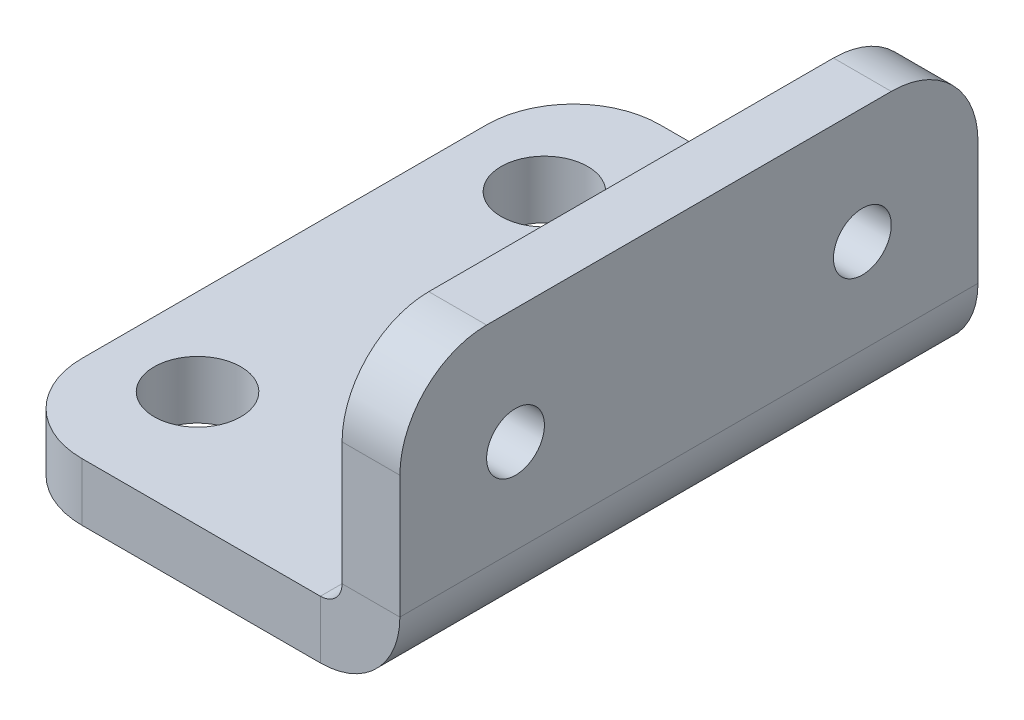
ISO-10303-21;
HEADER;
FILE_DESCRIPTION(('STEP AP214'),'2;1');
FILE_NAME('part.step','',(''),(''),'','','');
FILE_SCHEMA(('AUTOMOTIVE_DESIGN { 1 0 10303 214 1 1 1 1 }'));
ENDSEC;
DATA;
#1=APPLICATION_CONTEXT('core data for automotive mechanical design processes');
#2=APPLICATION_PROTOCOL_DEFINITION('international standard','automotive_design',2000,#1);
#3=PRODUCT_CONTEXT('',#1,'mechanical');
#4=PRODUCT('Part','Part','',(#3));
#5=PRODUCT_RELATED_PRODUCT_CATEGORY('part','',(#4));
#6=PRODUCT_DEFINITION_FORMATION('','',#4);
#7=PRODUCT_DEFINITION_CONTEXT('part definition',#1,'design');
#8=PRODUCT_DEFINITION('design','',#6,#7);
#9=PRODUCT_DEFINITION_SHAPE('','',#8);
#10=(LENGTH_UNIT() NAMED_UNIT(*) SI_UNIT(.MILLI.,.METRE.));
#11=(NAMED_UNIT(*) PLANE_ANGLE_UNIT() SI_UNIT($,.RADIAN.));
#12=(NAMED_UNIT(*) SI_UNIT($,.STERADIAN.) SOLID_ANGLE_UNIT());
#13=UNCERTAINTY_MEASURE_WITH_UNIT(LENGTH_MEASURE(1.E-05),#10,'distance_accuracy_value','');
#14=(GEOMETRIC_REPRESENTATION_CONTEXT(3) GLOBAL_UNCERTAINTY_ASSIGNED_CONTEXT((#13)) GLOBAL_UNIT_ASSIGNED_CONTEXT((#10,
#11,#12)) REPRESENTATION_CONTEXT('',''));
#15=CARTESIAN_POINT('',(0.,0.,0.));
#16=DIRECTION('',(0.,0.,1.));
#17=DIRECTION('',(1.,0.,0.));
#18=AXIS2_PLACEMENT_3D('',#15,#16,#17);
#19=CARTESIAN_POINT('',(0.,0.75,10.));
#20=DIRECTION('',(0.,0.,1.));
#21=DIRECTION('',(1.,0.,0.));
#22=AXIS2_PLACEMENT_3D('',#19,#20,#21);
#23=PLANE('',#22);
#24=DIRECTION('',(1.,0.,0.));
#25=VECTOR('',#24,1.);
#26=CARTESIAN_POINT('',(0.,0.75,10.));
#27=LINE('',#26,#25);
#28=CARTESIAN_POINT('',(0.,0.75,10.));
#29=VERTEX_POINT('',#28);
#30=CARTESIAN_POINT('',(2.,0.75,10.));
#31=VERTEX_POINT('',#30);
#32=EDGE_CURVE('E130',#29,#31,#27,.T.);
#33=ORIENTED_EDGE('',*,*,#32,.F.);
#34=CARTESIAN_POINT('',(-0.75,0.75,10.));
#35=DIRECTION('',(0.,0.,-1.));
#36=DIRECTION('',(-1.,0.,0.));
#37=AXIS2_PLACEMENT_3D('',#34,#35,#36);
#38=CIRCLE('',#37,0.75);
#39=CARTESIAN_POINT('',(-0.750000000000001,0.,10.));
#40=VERTEX_POINT('',#39);
#41=EDGE_CURVE('E134',#40,#29,#38,.F.);
#42=ORIENTED_EDGE('',*,*,#41,.F.);
#43=DIRECTION('',(0.,1.,0.));
#44=VECTOR('',#43,1.);
#45=CARTESIAN_POINT('',(-0.750000000000001,-2.,10.));
#46=LINE('',#45,#44);
#47=CARTESIAN_POINT('',(-0.750000000000001,-2.,10.));
#48=VERTEX_POINT('',#47);
#49=EDGE_CURVE('E139',#48,#40,#46,.T.);
#50=ORIENTED_EDGE('',*,*,#49,.F.);
#51=CARTESIAN_POINT('',(-0.75,0.75,10.));
#52=DIRECTION('',(0.,0.,1.));
#53=DIRECTION('',(1.,0.,0.));
#54=AXIS2_PLACEMENT_3D('',#51,#52,#53);
#55=CIRCLE('',#54,2.75);
#56=EDGE_CURVE('E136',#48,#31,#55,.T.);
#57=ORIENTED_EDGE('',*,*,#56,.T.);
#58=EDGE_LOOP('',(#33,#42,#50,#57));
#59=FACE_BOUND('',#58,.T.);
#60=ADVANCED_FACE('F39',(#59),#23,.T.);
#61=CARTESIAN_POINT('',(-0.750000000000001,-2.,10.));
#62=DIRECTION('',(0.,0.,1.));
#63=DIRECTION('',(1.,0.,0.));
#64=AXIS2_PLACEMENT_3D('',#61,#62,#63);
#65=PLANE('',#64);
#66=DIRECTION('',(0.,1.,0.));
#67=VECTOR('',#66,1.);
#68=CARTESIAN_POINT('',(2.,0.,10.));
#69=LINE('',#68,#67);
#70=CARTESIAN_POINT('',(2.,5.,10.));
#71=VERTEX_POINT('',#70);
#72=EDGE_CURVE('E157',#31,#71,#69,.T.);
#73=ORIENTED_EDGE('',*,*,#72,.T.);
#74=DIRECTION('',(1.,0.,0.));
#75=VECTOR('',#74,1.);
#76=CARTESIAN_POINT('',(-0.750000000000001,5.,10.));
#77=LINE('',#76,#75);
#78=CARTESIAN_POINT('',(0.,5.,10.));
#79=VERTEX_POINT('',#78);
#80=EDGE_CURVE('E11',#71,#79,#77,.F.);
#81=ORIENTED_EDGE('',*,*,#80,.T.);
#82=DIRECTION('',(0.,1.,0.));
#83=VECTOR('',#82,1.);
#84=CARTESIAN_POINT('',(0.,0.,10.));
#85=LINE('',#84,#83);
#86=EDGE_CURVE('E146',#29,#79,#85,.T.);
#87=ORIENTED_EDGE('',*,*,#86,.F.);
#88=ORIENTED_EDGE('',*,*,#32,.T.);
#89=EDGE_LOOP('',(#73,#81,#87,#88));
#90=FACE_BOUND('',#89,.T.);
#91=ADVANCED_FACE('F156',(#90),#65,.T.);
#92=CARTESIAN_POINT('',(-0.750000000000001,0.,-10.));
#93=DIRECTION('',(0.,0.,-1.));
#94=DIRECTION('',(-1.,0.,0.));
#95=AXIS2_PLACEMENT_3D('',#92,#93,#94);
#96=PLANE('',#95);
#97=DIRECTION('',(0.,-1.,0.));
#98=VECTOR('',#97,1.);
#99=CARTESIAN_POINT('',(-0.750000000000001,0.,-10.));
#100=LINE('',#99,#98);
#101=CARTESIAN_POINT('',(-0.750000000000001,0.,-10.));
#102=VERTEX_POINT('',#101);
#103=CARTESIAN_POINT('',(-0.750000000000001,-2.,-10.));
#104=VERTEX_POINT('',#103);
#105=EDGE_CURVE('E202',#102,#104,#100,.T.);
#106=ORIENTED_EDGE('',*,*,#105,.F.);
#107=CARTESIAN_POINT('',(-0.75,0.75,-10.));
#108=DIRECTION('',(0.,0.,-1.));
#109=DIRECTION('',(-1.,0.,0.));
#110=AXIS2_PLACEMENT_3D('',#107,#108,#109);
#111=CIRCLE('',#110,0.75);
#112=CARTESIAN_POINT('',(0.,0.75,-10.));
#113=VERTEX_POINT('',#112);
#114=EDGE_CURVE('E176',#102,#113,#111,.F.);
#115=ORIENTED_EDGE('',*,*,#114,.T.);
#116=DIRECTION('',(-1.,0.,0.));
#117=VECTOR('',#116,1.);
#118=CARTESIAN_POINT('',(2.,0.75,-10.));
#119=LINE('',#118,#117);
#120=CARTESIAN_POINT('',(2.,0.75,-10.));
#121=VERTEX_POINT('',#120);
#122=EDGE_CURVE('E200',#121,#113,#119,.T.);
#123=ORIENTED_EDGE('',*,*,#122,.F.);
#124=CARTESIAN_POINT('',(-0.75,0.75,-10.));
#125=DIRECTION('',(0.,0.,1.));
#126=DIRECTION('',(1.,0.,0.));
#127=AXIS2_PLACEMENT_3D('',#124,#125,#126);
#128=CIRCLE('',#127,2.75);
#129=EDGE_CURVE('E182',#104,#121,#128,.T.);
#130=ORIENTED_EDGE('',*,*,#129,.F.);
#131=EDGE_LOOP('',(#106,#115,#123,#130));
#132=FACE_BOUND('',#131,.T.);
#133=ADVANCED_FACE('F305',(#132),#96,.T.);
#134=CARTESIAN_POINT('',(2.,0.75,-10.));
#135=DIRECTION('',(0.,0.,-1.));
#136=DIRECTION('',(-1.,0.,0.));
#137=AXIS2_PLACEMENT_3D('',#134,#135,#136);
#138=PLANE('',#137);
#139=DIRECTION('',(1.,0.,0.));
#140=VECTOR('',#139,1.);
#141=CARTESIAN_POINT('',(-12.,-2.,-10.));
#142=LINE('',#141,#140);
#143=CARTESIAN_POINT('',(-9.,-2.,-10.));
#144=VERTEX_POINT('',#143);
#145=EDGE_CURVE('E180',#144,#104,#142,.T.);
#146=ORIENTED_EDGE('',*,*,#145,.F.);
#147=DIRECTION('',(0.,1.,0.));
#148=VECTOR('',#147,1.);
#149=CARTESIAN_POINT('',(-9.,0.75,-10.));
#150=LINE('',#149,#148);
#151=CARTESIAN_POINT('',(-9.,0.,-10.));
#152=VERTEX_POINT('',#151);
#153=EDGE_CURVE('E221',#144,#152,#150,.T.);
#154=ORIENTED_EDGE('',*,*,#153,.T.);
#155=DIRECTION('',(1.,0.,0.));
#156=VECTOR('',#155,1.);
#157=CARTESIAN_POINT('',(-12.,0.,-10.));
#158=LINE('',#157,#156);
#159=EDGE_CURVE('E178',#152,#102,#158,.T.);
#160=ORIENTED_EDGE('',*,*,#159,.T.);
#161=ORIENTED_EDGE('',*,*,#105,.T.);
#162=EDGE_LOOP('',(#146,#154,#160,#161));
#163=FACE_BOUND('',#162,.T.);
#164=ADVANCED_FACE('F358',(#163),#138,.T.);
#165=CARTESIAN_POINT('',(2.,0.,10.));
#166=DIRECTION('',(-1.,0.,0.));
#167=DIRECTION('',(0.,0.,1.));
#168=AXIS2_PLACEMENT_3D('',#165,#166,#167);
#169=PLANE('',#168);
#170=CARTESIAN_POINT('',(2.,4.,6.));
#171=DIRECTION('',(-1.,0.,0.));
#172=DIRECTION('',(0.,0.,1.));
#173=AXIS2_PLACEMENT_3D('',#170,#171,#172);
#174=CIRCLE('',#173,1.);
#175=CARTESIAN_POINT('',(2.,4.,7.));
#176=VERTEX_POINT('',#175);
#177=EDGE_CURVE('E255',#176,#176,#174,.T.);
#178=ORIENTED_EDGE('',*,*,#177,.T.);
#179=EDGE_LOOP('',(#178));
#180=FACE_BOUND('',#179,.T.);
#181=CARTESIAN_POINT('',(2.,3.99999999999992,-6.));
#182=DIRECTION('',(-1.,0.,0.));
#183=DIRECTION('',(0.,0.,1.));
#184=AXIS2_PLACEMENT_3D('',#181,#182,#183);
#185=CIRCLE('',#184,1.);
#186=CARTESIAN_POINT('',(2.,3.99999999999992,-5.));
#187=VERTEX_POINT('',#186);
#188=EDGE_CURVE('E266',#187,#187,#185,.T.);
#189=ORIENTED_EDGE('',*,*,#188,.T.);
#190=EDGE_LOOP('',(#189));
#191=FACE_BOUND('',#190,.T.);
#192=DIRECTION('',(0.,1.,0.));
#193=VECTOR('',#192,1.);
#194=CARTESIAN_POINT('',(2.,0.,-10.));
#195=LINE('',#194,#193);
#196=CARTESIAN_POINT('',(2.,5.,-10.));
#197=VERTEX_POINT('',#196);
#198=EDGE_CURVE('E171',#121,#197,#195,.T.);
#199=ORIENTED_EDGE('',*,*,#198,.T.);
#200=CARTESIAN_POINT('',(2.,5.,-7.));
#201=DIRECTION('',(-1.,0.,0.));
#202=DIRECTION('',(0.,0.,1.));
#203=AXIS2_PLACEMENT_3D('',#200,#201,#202);
#204=CIRCLE('',#203,3.);
#205=CARTESIAN_POINT('',(2.,8.,-7.));
#206=VERTEX_POINT('',#205);
#207=EDGE_CURVE('E229',#197,#206,#204,.F.);
#208=ORIENTED_EDGE('',*,*,#207,.T.);
#209=DIRECTION('',(0.,0.,-1.));
#210=VECTOR('',#209,1.);
#211=CARTESIAN_POINT('',(2.,8.,10.));
#212=LINE('',#211,#210);
#213=CARTESIAN_POINT('',(2.,8.,7.));
#214=VERTEX_POINT('',#213);
#215=EDGE_CURVE('E198',#214,#206,#212,.T.);
#216=ORIENTED_EDGE('',*,*,#215,.F.);
#217=CARTESIAN_POINT('',(2.,5.,7.));
#218=DIRECTION('',(-1.,0.,0.));
#219=DIRECTION('',(0.,0.,1.));
#220=AXIS2_PLACEMENT_3D('',#217,#218,#219);
#221=CIRCLE('',#220,3.);
#222=EDGE_CURVE('E227',#214,#71,#221,.F.);
#223=ORIENTED_EDGE('',*,*,#222,.T.);
#224=ORIENTED_EDGE('',*,*,#72,.F.);
#225=DIRECTION('',(0.,0.,-1.));
#226=VECTOR('',#225,1.);
#227=CARTESIAN_POINT('',(2.,0.75,10.));
#228=LINE('',#227,#226);
#229=EDGE_CURVE('E170',#31,#121,#228,.T.);
#230=ORIENTED_EDGE('',*,*,#229,.T.);
#231=EDGE_LOOP('',(#199,#208,#216,#223,#224,#230));
#232=FACE_BOUND('',#231,.T.);
#233=ADVANCED_FACE('F245',(#180,#191,#232),#169,.F.);
#234=CARTESIAN_POINT('',(0.,8.,10.));
#235=DIRECTION('',(0.,1.,0.));
#236=DIRECTION('',(0.,0.,1.));
#237=AXIS2_PLACEMENT_3D('',#234,#235,#236);
#238=PLANE('',#237);
#239=ORIENTED_EDGE('',*,*,#215,.T.);
#240=DIRECTION('',(1.,0.,0.));
#241=VECTOR('',#240,1.);
#242=CARTESIAN_POINT('',(0.,8.,-7.));
#243=LINE('',#242,#241);
#244=CARTESIAN_POINT('',(0.,8.,-7.));
#245=VERTEX_POINT('',#244);
#246=EDGE_CURVE('E60',#206,#245,#243,.F.);
#247=ORIENTED_EDGE('',*,*,#246,.T.);
#248=DIRECTION('',(0.,0.,-1.));
#249=VECTOR('',#248,1.);
#250=CARTESIAN_POINT('',(0.,8.,10.));
#251=LINE('',#250,#249);
#252=CARTESIAN_POINT('',(0.,8.,7.));
#253=VERTEX_POINT('',#252);
#254=EDGE_CURVE('E153',#253,#245,#251,.T.);
#255=ORIENTED_EDGE('',*,*,#254,.F.);
#256=DIRECTION('',(1.,0.,0.));
#257=VECTOR('',#256,1.);
#258=CARTESIAN_POINT('',(0.,8.,7.));
#259=LINE('',#258,#257);
#260=EDGE_CURVE('E231',#253,#214,#259,.T.);
#261=ORIENTED_EDGE('',*,*,#260,.T.);
#262=EDGE_LOOP('',(#239,#247,#255,#261));
#263=FACE_BOUND('',#262,.T.);
#264=ADVANCED_FACE('F246',(#263),#238,.T.);
#265=CARTESIAN_POINT('',(0.,0.,10.));
#266=DIRECTION('',(-1.,0.,0.));
#267=DIRECTION('',(0.,0.,1.));
#268=AXIS2_PLACEMENT_3D('',#265,#266,#267);
#269=PLANE('',#268);
#270=CARTESIAN_POINT('',(0.,4.,6.));
#271=DIRECTION('',(-1.,0.,0.));
#272=DIRECTION('',(0.,0.,1.));
#273=AXIS2_PLACEMENT_3D('',#270,#271,#272);
#274=CIRCLE('',#273,1.);
#275=CARTESIAN_POINT('',(0.,4.,7.));
#276=VERTEX_POINT('',#275);
#277=EDGE_CURVE('E269',#276,#276,#274,.T.);
#278=ORIENTED_EDGE('',*,*,#277,.F.);
#279=EDGE_LOOP('',(#278));
#280=FACE_BOUND('',#279,.T.);
#281=CARTESIAN_POINT('',(0.,3.99999999999992,-6.));
#282=DIRECTION('',(-1.,0.,0.));
#283=DIRECTION('',(0.,0.,1.));
#284=AXIS2_PLACEMENT_3D('',#281,#282,#283);
#285=CIRCLE('',#284,1.);
#286=CARTESIAN_POINT('',(0.,3.99999999999992,-5.));
#287=VERTEX_POINT('',#286);
#288=EDGE_CURVE('E263',#287,#287,#285,.T.);
#289=ORIENTED_EDGE('',*,*,#288,.F.);
#290=EDGE_LOOP('',(#289));
#291=FACE_BOUND('',#290,.T.);
#292=ORIENTED_EDGE('',*,*,#254,.T.);
#293=CARTESIAN_POINT('',(0.,5.,-7.));
#294=DIRECTION('',(-1.,0.,0.));
#295=DIRECTION('',(0.,0.,1.));
#296=AXIS2_PLACEMENT_3D('',#293,#294,#295);
#297=CIRCLE('',#296,3.);
#298=CARTESIAN_POINT('',(0.,5.,-10.));
#299=VERTEX_POINT('',#298);
#300=EDGE_CURVE('E47',#245,#299,#297,.T.);
#301=ORIENTED_EDGE('',*,*,#300,.T.);
#302=DIRECTION('',(0.,1.,0.));
#303=VECTOR('',#302,1.);
#304=CARTESIAN_POINT('',(0.,0.,-10.));
#305=LINE('',#304,#303);
#306=EDGE_CURVE('E149',#113,#299,#305,.T.);
#307=ORIENTED_EDGE('',*,*,#306,.F.);
#308=DIRECTION('',(0.,0.,-1.));
#309=VECTOR('',#308,1.);
#310=CARTESIAN_POINT('',(0.,0.75,10.));
#311=LINE('',#310,#309);
#312=EDGE_CURVE('E144',#29,#113,#311,.T.);
#313=ORIENTED_EDGE('',*,*,#312,.F.);
#314=ORIENTED_EDGE('',*,*,#86,.T.);
#315=CARTESIAN_POINT('',(0.,5.,7.));
#316=DIRECTION('',(-1.,0.,0.));
#317=DIRECTION('',(0.,0.,1.));
#318=AXIS2_PLACEMENT_3D('',#315,#316,#317);
#319=CIRCLE('',#318,3.);
#320=EDGE_CURVE('E235',#79,#253,#319,.T.);
#321=ORIENTED_EDGE('',*,*,#320,.T.);
#322=EDGE_LOOP('',(#292,#301,#307,#313,#314,#321));
#323=FACE_BOUND('',#322,.T.);
#324=ADVANCED_FACE('F145',(#280,#291,#323),#269,.T.);
#325=CARTESIAN_POINT('',(-0.75,0.75,10.));
#326=DIRECTION('',(0.,0.,-1.));
#327=DIRECTION('',(-1.,0.,0.));
#328=AXIS2_PLACEMENT_3D('',#325,#326,#327);
#329=CYLINDRICAL_SURFACE('',#328,0.75);
#330=ORIENTED_EDGE('',*,*,#114,.F.);
#331=DIRECTION('',(0.,0.,-1.));
#332=VECTOR('',#331,1.);
#333=CARTESIAN_POINT('',(-0.750000000000001,0.,10.));
#334=LINE('',#333,#332);
#335=EDGE_CURVE('E154',#40,#102,#334,.T.);
#336=ORIENTED_EDGE('',*,*,#335,.F.);
#337=ORIENTED_EDGE('',*,*,#41,.T.);
#338=ORIENTED_EDGE('',*,*,#312,.T.);
#339=EDGE_LOOP('',(#330,#336,#337,#338));
#340=FACE_BOUND('',#339,.T.);
#341=ADVANCED_FACE('F160',(#340),#329,.F.);
#342=CARTESIAN_POINT('',(-12.,0.,10.));
#343=DIRECTION('',(0.,1.,0.));
#344=DIRECTION('',(0.,0.,1.));
#345=AXIS2_PLACEMENT_3D('',#342,#343,#344);
#346=PLANE('',#345);
#347=CARTESIAN_POINT('',(-9.,0.,-6.));
#348=DIRECTION('',(0.,1.,0.));
#349=DIRECTION('',(0.,0.,1.));
#350=AXIS2_PLACEMENT_3D('',#347,#348,#349);
#351=CIRCLE('',#350,1.5);
#352=CARTESIAN_POINT('',(-9.,0.,-4.5));
#353=VERTEX_POINT('',#352);
#354=EDGE_CURVE('E258',#353,#353,#351,.T.);
#355=ORIENTED_EDGE('',*,*,#354,.F.);
#356=EDGE_LOOP('',(#355));
#357=FACE_BOUND('',#356,.T.);
#358=CARTESIAN_POINT('',(-9.,0.,6.));
#359=DIRECTION('',(0.,1.,0.));
#360=DIRECTION('',(0.,0.,-1.));
#361=AXIS2_PLACEMENT_3D('',#358,#359,#360);
#362=CIRCLE('',#361,1.5);
#363=CARTESIAN_POINT('',(-9.,0.,4.5));
#364=VERTEX_POINT('',#363);
#365=EDGE_CURVE('E251',#364,#364,#362,.T.);
#366=ORIENTED_EDGE('',*,*,#365,.F.);
#367=EDGE_LOOP('',(#366));
#368=FACE_BOUND('',#367,.T.);
#369=DIRECTION('',(0.,0.,-1.));
#370=VECTOR('',#369,1.);
#371=CARTESIAN_POINT('',(-12.,0.,10.));
#372=LINE('',#371,#370);
#373=CARTESIAN_POINT('',(-12.,0.,7.));
#374=VERTEX_POINT('',#373);
#375=CARTESIAN_POINT('',(-12.,0.,-7.));
#376=VERTEX_POINT('',#375);
#377=EDGE_CURVE('E193',#374,#376,#372,.T.);
#378=ORIENTED_EDGE('',*,*,#377,.F.);
#379=CARTESIAN_POINT('',(-9.,0.,7.));
#380=DIRECTION('',(0.,1.,0.));
#381=DIRECTION('',(0.,0.,1.));
#382=AXIS2_PLACEMENT_3D('',#379,#380,#381);
#383=CIRCLE('',#382,3.);
#384=CARTESIAN_POINT('',(-9.,0.,10.));
#385=VERTEX_POINT('',#384);
#386=EDGE_CURVE('E213',#374,#385,#383,.T.);
#387=ORIENTED_EDGE('',*,*,#386,.T.);
#388=DIRECTION('',(1.,0.,0.));
#389=VECTOR('',#388,1.);
#390=CARTESIAN_POINT('',(-12.,0.,10.));
#391=LINE('',#390,#389);
#392=EDGE_CURVE('E162',#385,#40,#391,.T.);
#393=ORIENTED_EDGE('',*,*,#392,.T.);
#394=ORIENTED_EDGE('',*,*,#335,.T.);
#395=ORIENTED_EDGE('',*,*,#159,.F.);
#396=CARTESIAN_POINT('',(-9.,0.,-7.));
#397=DIRECTION('',(0.,1.,0.));
#398=DIRECTION('',(0.,0.,1.));
#399=AXIS2_PLACEMENT_3D('',#396,#397,#398);
#400=CIRCLE('',#399,3.);
#401=EDGE_CURVE('E211',#152,#376,#400,.T.);
#402=ORIENTED_EDGE('',*,*,#401,.T.);
#403=EDGE_LOOP('',(#378,#387,#393,#394,#395,#402));
#404=FACE_BOUND('',#403,.T.);
#405=ADVANCED_FACE('F347',(#357,#368,#404),#346,.T.);
#406=CARTESIAN_POINT('',(-12.,-2.,10.));
#407=DIRECTION('',(-1.,0.,0.));
#408=DIRECTION('',(0.,0.,1.));
#409=AXIS2_PLACEMENT_3D('',#406,#407,#408);
#410=PLANE('',#409);
#411=DIRECTION('',(0.,0.,-1.));
#412=VECTOR('',#411,1.);
#413=CARTESIAN_POINT('',(-12.,-2.,10.));
#414=LINE('',#413,#412);
#415=CARTESIAN_POINT('',(-12.,-2.,7.));
#416=VERTEX_POINT('',#415);
#417=CARTESIAN_POINT('',(-12.,-2.,-7.));
#418=VERTEX_POINT('',#417);
#419=EDGE_CURVE('E190',#416,#418,#414,.T.);
#420=ORIENTED_EDGE('',*,*,#419,.F.);
#421=DIRECTION('',(0.,1.,0.));
#422=VECTOR('',#421,1.);
#423=CARTESIAN_POINT('',(-12.,0.,7.));
#424=LINE('',#423,#422);
#425=EDGE_CURVE('E208',#416,#374,#424,.T.);
#426=ORIENTED_EDGE('',*,*,#425,.T.);
#427=ORIENTED_EDGE('',*,*,#377,.T.);
#428=DIRECTION('',(0.,1.,0.));
#429=VECTOR('',#428,1.);
#430=CARTESIAN_POINT('',(-12.,-2.,-7.));
#431=LINE('',#430,#429);
#432=EDGE_CURVE('E138',#376,#418,#431,.F.);
#433=ORIENTED_EDGE('',*,*,#432,.T.);
#434=EDGE_LOOP('',(#420,#426,#427,#433));
#435=FACE_BOUND('',#434,.T.);
#436=ADVANCED_FACE('F343',(#435),#410,.T.);
#437=CARTESIAN_POINT('',(-12.,-2.,10.));
#438=DIRECTION('',(0.,1.,0.));
#439=DIRECTION('',(0.,0.,1.));
#440=AXIS2_PLACEMENT_3D('',#437,#438,#439);
#441=PLANE('',#440);
#442=CARTESIAN_POINT('',(-9.,-2.,-6.));
#443=DIRECTION('',(0.,1.,0.));
#444=DIRECTION('',(0.,0.,1.));
#445=AXIS2_PLACEMENT_3D('',#442,#443,#444);
#446=CIRCLE('',#445,1.5);
#447=CARTESIAN_POINT('',(-9.,-2.,-4.5));
#448=VERTEX_POINT('',#447);
#449=EDGE_CURVE('E174',#448,#448,#446,.T.);
#450=ORIENTED_EDGE('',*,*,#449,.T.);
#451=EDGE_LOOP('',(#450));
#452=FACE_BOUND('',#451,.T.);
#453=CARTESIAN_POINT('',(-9.,-2.,6.));
#454=DIRECTION('',(0.,1.,0.));
#455=DIRECTION('',(0.,0.,-1.));
#456=AXIS2_PLACEMENT_3D('',#453,#454,#455);
#457=CIRCLE('',#456,1.5);
#458=CARTESIAN_POINT('',(-9.,-2.,4.5));
#459=VERTEX_POINT('',#458);
#460=EDGE_CURVE('E254',#459,#459,#457,.T.);
#461=ORIENTED_EDGE('',*,*,#460,.T.);
#462=EDGE_LOOP('',(#461));
#463=FACE_BOUND('',#462,.T.);
#464=DIRECTION('',(1.,0.,0.));
#465=VECTOR('',#464,1.);
#466=CARTESIAN_POINT('',(-12.,-2.,10.));
#467=LINE('',#466,#465);
#468=CARTESIAN_POINT('',(-9.,-2.,10.));
#469=VERTEX_POINT('',#468);
#470=EDGE_CURVE('E164',#469,#48,#467,.T.);
#471=ORIENTED_EDGE('',*,*,#470,.F.);
#472=CARTESIAN_POINT('',(-9.,-2.,7.));
#473=DIRECTION('',(0.,1.,0.));
#474=DIRECTION('',(0.,0.,1.));
#475=AXIS2_PLACEMENT_3D('',#472,#473,#474);
#476=CIRCLE('',#475,3.);
#477=EDGE_CURVE('E219',#469,#416,#476,.F.);
#478=ORIENTED_EDGE('',*,*,#477,.T.);
#479=ORIENTED_EDGE('',*,*,#419,.T.);
#480=CARTESIAN_POINT('',(-9.,-2.,-7.));
#481=DIRECTION('',(0.,1.,0.));
#482=DIRECTION('',(0.,0.,1.));
#483=AXIS2_PLACEMENT_3D('',#480,#481,#482);
#484=CIRCLE('',#483,3.);
#485=EDGE_CURVE('E217',#418,#144,#484,.F.);
#486=ORIENTED_EDGE('',*,*,#485,.T.);
#487=ORIENTED_EDGE('',*,*,#145,.T.);
#488=DIRECTION('',(0.,0.,-1.));
#489=VECTOR('',#488,1.);
#490=CARTESIAN_POINT('',(-0.750000000000001,-2.,10.));
#491=LINE('',#490,#489);
#492=EDGE_CURVE('E187',#48,#104,#491,.T.);
#493=ORIENTED_EDGE('',*,*,#492,.F.);
#494=EDGE_LOOP('',(#471,#478,#479,#486,#487,#493));
#495=FACE_BOUND('',#494,.T.);
#496=ADVANCED_FACE('F339',(#452,#463,#495),#441,.F.);
#497=CARTESIAN_POINT('',(-0.75,0.75,10.));
#498=DIRECTION('',(0.,0.,-1.));
#499=DIRECTION('',(-1.,0.,0.));
#500=AXIS2_PLACEMENT_3D('',#497,#498,#499);
#501=CYLINDRICAL_SURFACE('',#500,2.75);
#502=ORIENTED_EDGE('',*,*,#129,.T.);
#503=ORIENTED_EDGE('',*,*,#229,.F.);
#504=ORIENTED_EDGE('',*,*,#56,.F.);
#505=ORIENTED_EDGE('',*,*,#492,.T.);
#506=EDGE_LOOP('',(#502,#503,#504,#505));
#507=FACE_BOUND('',#506,.T.);
#508=ADVANCED_FACE('F333',(#507),#501,.T.);
#509=CARTESIAN_POINT('',(-0.75,0.75,10.));
#510=DIRECTION('',(0.,0.,-1.));
#511=DIRECTION('',(-1.,0.,0.));
#512=AXIS2_PLACEMENT_3D('',#509,#510,#511);
#513=PLANE('',#512);
#514=ORIENTED_EDGE('',*,*,#392,.F.);
#515=DIRECTION('',(0.,1.,0.));
#516=VECTOR('',#515,1.);
#517=CARTESIAN_POINT('',(-9.,-2.,10.));
#518=LINE('',#517,#516);
#519=EDGE_CURVE('E215',#385,#469,#518,.F.);
#520=ORIENTED_EDGE('',*,*,#519,.T.);
#521=ORIENTED_EDGE('',*,*,#470,.T.);
#522=ORIENTED_EDGE('',*,*,#49,.T.);
#523=EDGE_LOOP('',(#514,#520,#521,#522));
#524=FACE_BOUND('',#523,.T.);
#525=ADVANCED_FACE('F330',(#524),#513,.F.);
#526=CARTESIAN_POINT('',(-0.75,0.75,-10.));
#527=DIRECTION('',(0.,0.,-1.));
#528=DIRECTION('',(-1.,0.,0.));
#529=AXIS2_PLACEMENT_3D('',#526,#527,#528);
#530=PLANE('',#529);
#531=ORIENTED_EDGE('',*,*,#306,.T.);
#532=DIRECTION('',(1.,0.,0.));
#533=VECTOR('',#532,1.);
#534=CARTESIAN_POINT('',(-0.75,5.,-10.));
#535=LINE('',#534,#533);
#536=EDGE_CURVE('E224',#299,#197,#535,.T.);
#537=ORIENTED_EDGE('',*,*,#536,.T.);
#538=ORIENTED_EDGE('',*,*,#198,.F.);
#539=ORIENTED_EDGE('',*,*,#122,.T.);
#540=EDGE_LOOP('',(#531,#537,#538,#539));
#541=FACE_BOUND('',#540,.T.);
#542=ADVANCED_FACE('F240',(#541),#530,.T.);
#543=CARTESIAN_POINT('',(-9.,-2.,7.));
#544=DIRECTION('',(0.,-1.,0.));
#545=DIRECTION('',(0.,0.,-1.));
#546=AXIS2_PLACEMENT_3D('',#543,#544,#545);
#547=CYLINDRICAL_SURFACE('',#546,3.);
#548=ORIENTED_EDGE('',*,*,#477,.F.);
#549=ORIENTED_EDGE('',*,*,#519,.F.);
#550=ORIENTED_EDGE('',*,*,#386,.F.);
#551=ORIENTED_EDGE('',*,*,#425,.F.);
#552=EDGE_LOOP('',(#548,#549,#550,#551));
#553=FACE_BOUND('',#552,.T.);
#554=ADVANCED_FACE('F309',(#553),#547,.T.);
#555=CARTESIAN_POINT('',(-9.,0.75,-7.));
#556=DIRECTION('',(0.,1.,0.));
#557=DIRECTION('',(0.,0.,1.));
#558=AXIS2_PLACEMENT_3D('',#555,#556,#557);
#559=CYLINDRICAL_SURFACE('',#558,3.);
#560=ORIENTED_EDGE('',*,*,#485,.F.);
#561=ORIENTED_EDGE('',*,*,#432,.F.);
#562=ORIENTED_EDGE('',*,*,#401,.F.);
#563=ORIENTED_EDGE('',*,*,#153,.F.);
#564=EDGE_LOOP('',(#560,#561,#562,#563));
#565=FACE_BOUND('',#564,.T.);
#566=ADVANCED_FACE('F312',(#565),#559,.T.);
#567=CARTESIAN_POINT('',(-0.75,5.,-7.));
#568=DIRECTION('',(1.,0.,0.));
#569=DIRECTION('',(0.,0.,-1.));
#570=AXIS2_PLACEMENT_3D('',#567,#568,#569);
#571=CYLINDRICAL_SURFACE('',#570,3.);
#572=ORIENTED_EDGE('',*,*,#300,.F.);
#573=ORIENTED_EDGE('',*,*,#246,.F.);
#574=ORIENTED_EDGE('',*,*,#207,.F.);
#575=ORIENTED_EDGE('',*,*,#536,.F.);
#576=EDGE_LOOP('',(#572,#573,#574,#575));
#577=FACE_BOUND('',#576,.T.);
#578=ADVANCED_FACE('F242',(#577),#571,.T.);
#579=CARTESIAN_POINT('',(0.,5.,7.));
#580=DIRECTION('',(1.,0.,0.));
#581=DIRECTION('',(0.,0.,-1.));
#582=AXIS2_PLACEMENT_3D('',#579,#580,#581);
#583=CYLINDRICAL_SURFACE('',#582,3.);
#584=ORIENTED_EDGE('',*,*,#320,.F.);
#585=ORIENTED_EDGE('',*,*,#80,.F.);
#586=ORIENTED_EDGE('',*,*,#222,.F.);
#587=ORIENTED_EDGE('',*,*,#260,.F.);
#588=EDGE_LOOP('',(#584,#585,#586,#587));
#589=FACE_BOUND('',#588,.T.);
#590=ADVANCED_FACE('F41',(#589),#583,.T.);
#591=CARTESIAN_POINT('',(-9.,-2.,6.));
#592=DIRECTION('',(0.,1.,0.));
#593=DIRECTION('',(0.,0.,1.));
#594=AXIS2_PLACEMENT_3D('',#591,#592,#593);
#595=CYLINDRICAL_SURFACE('',#594,1.5);
#596=ORIENTED_EDGE('',*,*,#460,.F.);
#597=EDGE_LOOP('',(#596));
#598=FACE_BOUND('',#597,.T.);
#599=ORIENTED_EDGE('',*,*,#365,.T.);
#600=EDGE_LOOP('',(#599));
#601=FACE_BOUND('',#600,.T.);
#602=ADVANCED_FACE('F296',(#598,#601),#595,.F.);
#603=CARTESIAN_POINT('',(-9.,-2.,-6.));
#604=DIRECTION('',(0.,1.,0.));
#605=DIRECTION('',(0.,0.,1.));
#606=AXIS2_PLACEMENT_3D('',#603,#604,#605);
#607=CYLINDRICAL_SURFACE('',#606,1.5);
#608=ORIENTED_EDGE('',*,*,#449,.F.);
#609=EDGE_LOOP('',(#608));
#610=FACE_BOUND('',#609,.T.);
#611=ORIENTED_EDGE('',*,*,#354,.T.);
#612=EDGE_LOOP('',(#611));
#613=FACE_BOUND('',#612,.T.);
#614=ADVANCED_FACE('F290',(#610,#613),#607,.F.);
#615=CARTESIAN_POINT('',(2.,3.99999999999992,-6.));
#616=DIRECTION('',(-1.,0.,0.));
#617=DIRECTION('',(0.,0.,1.));
#618=AXIS2_PLACEMENT_3D('',#615,#616,#617);
#619=CYLINDRICAL_SURFACE('',#618,1.);
#620=ORIENTED_EDGE('',*,*,#188,.F.);
#621=EDGE_LOOP('',(#620));
#622=FACE_BOUND('',#621,.T.);
#623=ORIENTED_EDGE('',*,*,#288,.T.);
#624=EDGE_LOOP('',(#623));
#625=FACE_BOUND('',#624,.T.);
#626=ADVANCED_FACE('F280',(#622,#625),#619,.F.);
#627=CARTESIAN_POINT('',(2.,4.,6.));
#628=DIRECTION('',(-1.,0.,0.));
#629=DIRECTION('',(0.,0.,1.));
#630=AXIS2_PLACEMENT_3D('',#627,#628,#629);
#631=CYLINDRICAL_SURFACE('',#630,1.);
#632=ORIENTED_EDGE('',*,*,#177,.F.);
#633=EDGE_LOOP('',(#632));
#634=FACE_BOUND('',#633,.T.);
#635=ORIENTED_EDGE('',*,*,#277,.T.);
#636=EDGE_LOOP('',(#635));
#637=FACE_BOUND('',#636,.T.);
#638=ADVANCED_FACE('F277',(#634,#637),#631,.F.);
#639=CLOSED_SHELL('',(#60,#91,#133,#164,#233,#264,#324,#341,#405,#436,#496,#508,#525,#542,#554,
#566,#578,#590,#602,#614,#626,#638));
#640=MANIFOLD_SOLID_BREP('B2',#639);
#641=ADVANCED_BREP_SHAPE_REPRESENTATION('',(#18,#640),#14);
#642=SHAPE_DEFINITION_REPRESENTATION(#9,#641);
ENDSEC;
END-ISO-10303-21;
